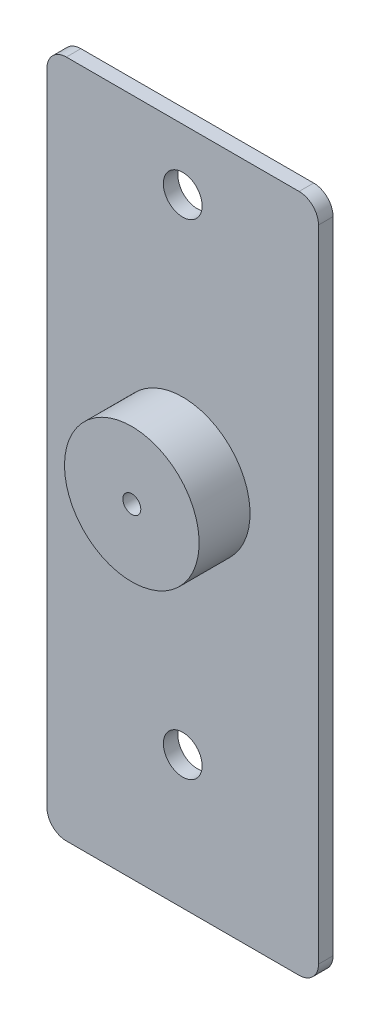
ISO-10303-21;
HEADER;
FILE_DESCRIPTION(('STEP AP214'),'2;1');
FILE_NAME('part.step','',(''),(''),'','','');
FILE_SCHEMA(('AUTOMOTIVE_DESIGN { 1 0 10303 214 1 1 1 1 }'));
ENDSEC;
DATA;
#1=APPLICATION_CONTEXT('core data for automotive mechanical design processes');
#2=APPLICATION_PROTOCOL_DEFINITION('international standard','automotive_design',2000,#1);
#3=PRODUCT_CONTEXT('',#1,'mechanical');
#4=PRODUCT('Part','Part','',(#3));
#5=PRODUCT_RELATED_PRODUCT_CATEGORY('part','',(#4));
#6=PRODUCT_DEFINITION_FORMATION('','',#4);
#7=PRODUCT_DEFINITION_CONTEXT('part definition',#1,'design');
#8=PRODUCT_DEFINITION('design','',#6,#7);
#9=PRODUCT_DEFINITION_SHAPE('','',#8);
#10=(LENGTH_UNIT() NAMED_UNIT(*) SI_UNIT(.MILLI.,.METRE.));
#11=(NAMED_UNIT(*) PLANE_ANGLE_UNIT() SI_UNIT($,.RADIAN.));
#12=(NAMED_UNIT(*) SI_UNIT($,.STERADIAN.) SOLID_ANGLE_UNIT());
#13=UNCERTAINTY_MEASURE_WITH_UNIT(LENGTH_MEASURE(1.E-05),#10,'distance_accuracy_value','');
#14=(GEOMETRIC_REPRESENTATION_CONTEXT(3) GLOBAL_UNCERTAINTY_ASSIGNED_CONTEXT((#13)) GLOBAL_UNIT_ASSIGNED_CONTEXT((#10,
#11,#12)) REPRESENTATION_CONTEXT('',''));
#15=CARTESIAN_POINT('',(0.,0.,0.));
#16=DIRECTION('',(0.,0.,1.));
#17=DIRECTION('',(1.,0.,0.));
#18=AXIS2_PLACEMENT_3D('',#15,#16,#17);
#19=CARTESIAN_POINT('',(0.,0.,0.));
#20=DIRECTION('',(0.,0.,-1.));
#21=DIRECTION('',(-1.,0.,0.));
#22=AXIS2_PLACEMENT_3D('',#19,#20,#21);
#23=PLANE('',#22);
#24=CARTESIAN_POINT('',(-0.000493654481067279,28.7050018310547,0.));
#25=DIRECTION('',(0.,0.,-1.));
#26=DIRECTION('',(-1.,0.,0.));
#27=AXIS2_PLACEMENT_3D('',#24,#25,#26);
#28=CIRCLE('',#27,2.);
#29=CARTESIAN_POINT('',(-2.00049365448107,28.7050018310547,0.));
#30=VERTEX_POINT('',#29);
#31=EDGE_CURVE('E186',#30,#30,#28,.T.);
#32=ORIENTED_EDGE('',*,*,#31,.T.);
#33=EDGE_LOOP('',(#32));
#34=FACE_BOUND('',#33,.T.);
#35=CARTESIAN_POINT('',(-0.000493892899487702,-21.2950005531311,0.));
#36=DIRECTION('',(0.,0.,-1.));
#37=DIRECTION('',(-1.,0.,0.));
#38=AXIS2_PLACEMENT_3D('',#35,#36,#37);
#39=CIRCLE('',#38,2.);
#40=CARTESIAN_POINT('',(-2.00049389289949,-21.2950005531311,0.));
#41=VERTEX_POINT('',#40);
#42=EDGE_CURVE('E180',#41,#41,#39,.T.);
#43=ORIENTED_EDGE('',*,*,#42,.T.);
#44=EDGE_LOOP('',(#43));
#45=FACE_BOUND('',#44,.T.);
#46=DIRECTION('',(-1.,0.,0.));
#47=VECTOR('',#46,1.);
#48=CARTESIAN_POINT('',(14.,-35.,0.));
#49=LINE('',#48,#47);
#50=CARTESIAN_POINT('',(12.,-35.,0.));
#51=VERTEX_POINT('',#50);
#52=CARTESIAN_POINT('',(-12.,-35.,0.));
#53=VERTEX_POINT('',#52);
#54=EDGE_CURVE('E115',#51,#53,#49,.T.);
#55=ORIENTED_EDGE('',*,*,#54,.F.);
#56=CARTESIAN_POINT('',(12.,-33.,0.));
#57=DIRECTION('',(0.,0.,-1.));
#58=DIRECTION('',(-1.,0.,0.));
#59=AXIS2_PLACEMENT_3D('',#56,#57,#58);
#60=CIRCLE('',#59,2.);
#61=CARTESIAN_POINT('',(14.,-33.,0.));
#62=VERTEX_POINT('',#61);
#63=EDGE_CURVE('E98',#51,#62,#60,.F.);
#64=ORIENTED_EDGE('',*,*,#63,.T.);
#65=DIRECTION('',(0.,-1.,0.));
#66=VECTOR('',#65,1.);
#67=CARTESIAN_POINT('',(14.,35.,0.));
#68=LINE('',#67,#66);
#69=CARTESIAN_POINT('',(14.,33.,0.));
#70=VERTEX_POINT('',#69);
#71=EDGE_CURVE('E125',#70,#62,#68,.T.);
#72=ORIENTED_EDGE('',*,*,#71,.F.);
#73=CARTESIAN_POINT('',(12.,33.,0.));
#74=DIRECTION('',(0.,0.,-1.));
#75=DIRECTION('',(-1.,0.,0.));
#76=AXIS2_PLACEMENT_3D('',#73,#74,#75);
#77=CIRCLE('',#76,2.);
#78=CARTESIAN_POINT('',(12.,35.,0.));
#79=VERTEX_POINT('',#78);
#80=EDGE_CURVE('E119',#70,#79,#77,.F.);
#81=ORIENTED_EDGE('',*,*,#80,.T.);
#82=DIRECTION('',(-1.,0.,0.));
#83=VECTOR('',#82,1.);
#84=CARTESIAN_POINT('',(14.,35.,0.));
#85=LINE('',#84,#83);
#86=CARTESIAN_POINT('',(-12.,35.,0.));
#87=VERTEX_POINT('',#86);
#88=EDGE_CURVE('E127',#79,#87,#85,.T.);
#89=ORIENTED_EDGE('',*,*,#88,.T.);
#90=CARTESIAN_POINT('',(-12.,33.,0.));
#91=DIRECTION('',(0.,0.,-1.));
#92=DIRECTION('',(-1.,0.,0.));
#93=AXIS2_PLACEMENT_3D('',#90,#91,#92);
#94=CIRCLE('',#93,2.);
#95=CARTESIAN_POINT('',(-14.,33.,0.));
#96=VERTEX_POINT('',#95);
#97=EDGE_CURVE('E142',#87,#96,#94,.F.);
#98=ORIENTED_EDGE('',*,*,#97,.T.);
#99=DIRECTION('',(0.,-1.,0.));
#100=VECTOR('',#99,1.);
#101=CARTESIAN_POINT('',(-14.,35.,0.));
#102=LINE('',#101,#100);
#103=CARTESIAN_POINT('',(-14.,-33.,0.));
#104=VERTEX_POINT('',#103);
#105=EDGE_CURVE('E124',#96,#104,#102,.T.);
#106=ORIENTED_EDGE('',*,*,#105,.T.);
#107=CARTESIAN_POINT('',(-12.,-33.,0.));
#108=DIRECTION('',(0.,0.,-1.));
#109=DIRECTION('',(-1.,0.,0.));
#110=AXIS2_PLACEMENT_3D('',#107,#108,#109);
#111=CIRCLE('',#110,2.);
#112=EDGE_CURVE('E109',#104,#53,#111,.F.);
#113=ORIENTED_EDGE('',*,*,#112,.T.);
#114=EDGE_LOOP('',(#55,#64,#72,#81,#89,#98,#106,#113));
#115=FACE_BOUND('',#114,.T.);
#116=CARTESIAN_POINT('',(0.,3.70356149548704,0.));
#117=DIRECTION('',(0.,0.,-1.));
#118=DIRECTION('',(-1.,0.,0.));
#119=AXIS2_PLACEMENT_3D('',#116,#117,#118);
#120=CIRCLE('',#119,6.94149340080354);
#121=CARTESIAN_POINT('',(-6.94149340080354,3.70356149548704,0.));
#122=VERTEX_POINT('',#121);
#123=EDGE_CURVE('E136',#122,#122,#120,.F.);
#124=ORIENTED_EDGE('',*,*,#123,.F.);
#125=EDGE_LOOP('',(#124));
#126=FACE_BOUND('',#125,.T.);
#127=ADVANCED_FACE('F32',(#34,#45,#115,#126),#23,.F.);
#128=CARTESIAN_POINT('',(14.,35.,-1.5));
#129=DIRECTION('',(-1.,0.,0.));
#130=DIRECTION('',(0.,-1.,0.));
#131=AXIS2_PLACEMENT_3D('',#128,#129,#130);
#132=PLANE('',#131);
#133=ORIENTED_EDGE('',*,*,#71,.T.);
#134=DIRECTION('',(0.,0.,1.));
#135=VECTOR('',#134,1.);
#136=CARTESIAN_POINT('',(14.,-33.,-1.5));
#137=LINE('',#136,#135);
#138=CARTESIAN_POINT('',(14.,-33.,-1.5));
#139=VERTEX_POINT('',#138);
#140=EDGE_CURVE('E103',#62,#139,#137,.F.);
#141=ORIENTED_EDGE('',*,*,#140,.T.);
#142=DIRECTION('',(0.,-1.,0.));
#143=VECTOR('',#142,1.);
#144=CARTESIAN_POINT('',(14.,35.,-1.5));
#145=LINE('',#144,#143);
#146=CARTESIAN_POINT('',(14.,33.,-1.5));
#147=VERTEX_POINT('',#146);
#148=EDGE_CURVE('E135',#147,#139,#145,.T.);
#149=ORIENTED_EDGE('',*,*,#148,.F.);
#150=DIRECTION('',(0.,0.,1.));
#151=VECTOR('',#150,1.);
#152=CARTESIAN_POINT('',(14.,33.,0.));
#153=LINE('',#152,#151);
#154=EDGE_CURVE('E108',#147,#70,#153,.T.);
#155=ORIENTED_EDGE('',*,*,#154,.T.);
#156=EDGE_LOOP('',(#133,#141,#149,#155));
#157=FACE_BOUND('',#156,.T.);
#158=ADVANCED_FACE('F220',(#157),#132,.F.);
#159=CARTESIAN_POINT('',(14.,-35.,-1.5));
#160=DIRECTION('',(0.,1.,0.));
#161=DIRECTION('',(0.,0.,1.));
#162=AXIS2_PLACEMENT_3D('',#159,#160,#161);
#163=PLANE('',#162);
#164=DIRECTION('',(-1.,0.,0.));
#165=VECTOR('',#164,1.);
#166=CARTESIAN_POINT('',(14.,-35.,-1.5));
#167=LINE('',#166,#165);
#168=CARTESIAN_POINT('',(12.,-35.,-1.5));
#169=VERTEX_POINT('',#168);
#170=CARTESIAN_POINT('',(-12.,-35.,-1.5));
#171=VERTEX_POINT('',#170);
#172=EDGE_CURVE('E118',#169,#171,#167,.T.);
#173=ORIENTED_EDGE('',*,*,#172,.F.);
#174=DIRECTION('',(0.,0.,1.));
#175=VECTOR('',#174,1.);
#176=CARTESIAN_POINT('',(12.,-35.,-1.5));
#177=LINE('',#176,#175);
#178=EDGE_CURVE('E102',#169,#51,#177,.T.);
#179=ORIENTED_EDGE('',*,*,#178,.T.);
#180=ORIENTED_EDGE('',*,*,#54,.T.);
#181=DIRECTION('',(0.,0.,1.));
#182=VECTOR('',#181,1.);
#183=CARTESIAN_POINT('',(-12.,-35.,-1.5));
#184=LINE('',#183,#182);
#185=EDGE_CURVE('E120',#53,#171,#184,.F.);
#186=ORIENTED_EDGE('',*,*,#185,.T.);
#187=EDGE_LOOP('',(#173,#179,#180,#186));
#188=FACE_BOUND('',#187,.T.);
#189=ADVANCED_FACE('F114',(#188),#163,.F.);
#190=CARTESIAN_POINT('',(-14.,35.,-1.5));
#191=DIRECTION('',(-1.,0.,0.));
#192=DIRECTION('',(0.,-1.,0.));
#193=AXIS2_PLACEMENT_3D('',#190,#191,#192);
#194=PLANE('',#193);
#195=DIRECTION('',(0.,-1.,0.));
#196=VECTOR('',#195,1.);
#197=CARTESIAN_POINT('',(-14.,35.,-1.5));
#198=LINE('',#197,#196);
#199=CARTESIAN_POINT('',(-14.,33.,-1.5));
#200=VERTEX_POINT('',#199);
#201=CARTESIAN_POINT('',(-14.,-33.,-1.5));
#202=VERTEX_POINT('',#201);
#203=EDGE_CURVE('E165',#200,#202,#198,.T.);
#204=ORIENTED_EDGE('',*,*,#203,.T.);
#205=DIRECTION('',(0.,0.,1.));
#206=VECTOR('',#205,1.);
#207=CARTESIAN_POINT('',(-14.,-33.,0.));
#208=LINE('',#207,#206);
#209=EDGE_CURVE('E157',#202,#104,#208,.T.);
#210=ORIENTED_EDGE('',*,*,#209,.T.);
#211=ORIENTED_EDGE('',*,*,#105,.F.);
#212=DIRECTION('',(0.,0.,1.));
#213=VECTOR('',#212,1.);
#214=CARTESIAN_POINT('',(-14.,33.,-1.5));
#215=LINE('',#214,#213);
#216=EDGE_CURVE('E155',#96,#200,#215,.F.);
#217=ORIENTED_EDGE('',*,*,#216,.T.);
#218=EDGE_LOOP('',(#204,#210,#211,#217));
#219=FACE_BOUND('',#218,.T.);
#220=ADVANCED_FACE('F163',(#219),#194,.T.);
#221=CARTESIAN_POINT('',(14.,35.,-1.5));
#222=DIRECTION('',(0.,1.,0.));
#223=DIRECTION('',(0.,0.,1.));
#224=AXIS2_PLACEMENT_3D('',#221,#222,#223);
#225=PLANE('',#224);
#226=DIRECTION('',(-1.,0.,0.));
#227=VECTOR('',#226,1.);
#228=CARTESIAN_POINT('',(14.,35.,-1.5));
#229=LINE('',#228,#227);
#230=CARTESIAN_POINT('',(12.,35.,-1.5));
#231=VERTEX_POINT('',#230);
#232=CARTESIAN_POINT('',(-12.,35.,-1.5));
#233=VERTEX_POINT('',#232);
#234=EDGE_CURVE('E139',#231,#233,#229,.T.);
#235=ORIENTED_EDGE('',*,*,#234,.T.);
#236=DIRECTION('',(0.,0.,1.));
#237=VECTOR('',#236,1.);
#238=CARTESIAN_POINT('',(-12.,35.,-1.5));
#239=LINE('',#238,#237);
#240=EDGE_CURVE('E11',#233,#87,#239,.T.);
#241=ORIENTED_EDGE('',*,*,#240,.T.);
#242=ORIENTED_EDGE('',*,*,#88,.F.);
#243=DIRECTION('',(0.,0.,1.));
#244=VECTOR('',#243,1.);
#245=CARTESIAN_POINT('',(12.,35.,-1.5));
#246=LINE('',#245,#244);
#247=EDGE_CURVE('E40',#79,#231,#246,.F.);
#248=ORIENTED_EDGE('',*,*,#247,.T.);
#249=EDGE_LOOP('',(#235,#241,#242,#248));
#250=FACE_BOUND('',#249,.T.);
#251=ADVANCED_FACE('F171',(#250),#225,.T.);
#252=CARTESIAN_POINT('',(0.,0.,-1.5));
#253=DIRECTION('',(0.,0.,-1.));
#254=DIRECTION('',(-1.,0.,0.));
#255=AXIS2_PLACEMENT_3D('',#252,#253,#254);
#256=PLANE('',#255);
#257=CARTESIAN_POINT('',(0.,3.70356149548704,-1.5));
#258=DIRECTION('',(0.,0.,-1.));
#259=DIRECTION('',(-1.,0.,0.));
#260=AXIS2_PLACEMENT_3D('',#257,#258,#259);
#261=CIRCLE('',#260,0.925);
#262=CARTESIAN_POINT('',(-0.925,3.70356149548704,-1.5));
#263=VERTEX_POINT('',#262);
#264=EDGE_CURVE('E193',#263,#263,#261,.T.);
#265=ORIENTED_EDGE('',*,*,#264,.F.);
#266=EDGE_LOOP('',(#265));
#267=FACE_BOUND('',#266,.T.);
#268=CARTESIAN_POINT('',(-0.000493654481067279,28.7050018310547,-1.5));
#269=DIRECTION('',(0.,0.,-1.));
#270=DIRECTION('',(-1.,0.,0.));
#271=AXIS2_PLACEMENT_3D('',#268,#269,#270);
#272=CIRCLE('',#271,2.);
#273=CARTESIAN_POINT('',(-2.00049365448107,28.7050018310547,-1.5));
#274=VERTEX_POINT('',#273);
#275=EDGE_CURVE('E189',#274,#274,#272,.T.);
#276=ORIENTED_EDGE('',*,*,#275,.F.);
#277=EDGE_LOOP('',(#276));
#278=FACE_BOUND('',#277,.T.);
#279=CARTESIAN_POINT('',(-0.000493892899487702,-21.2950005531311,-1.5));
#280=DIRECTION('',(0.,0.,-1.));
#281=DIRECTION('',(-1.,0.,0.));
#282=AXIS2_PLACEMENT_3D('',#279,#280,#281);
#283=CIRCLE('',#282,2.);
#284=CARTESIAN_POINT('',(-2.00049389289949,-21.2950005531311,-1.5));
#285=VERTEX_POINT('',#284);
#286=EDGE_CURVE('E183',#285,#285,#283,.T.);
#287=ORIENTED_EDGE('',*,*,#286,.F.);
#288=EDGE_LOOP('',(#287));
#289=FACE_BOUND('',#288,.T.);
#290=ORIENTED_EDGE('',*,*,#148,.T.);
#291=CARTESIAN_POINT('',(12.,-33.,-1.5));
#292=DIRECTION('',(0.,0.,-1.));
#293=DIRECTION('',(-1.,0.,0.));
#294=AXIS2_PLACEMENT_3D('',#291,#292,#293);
#295=CIRCLE('',#294,2.);
#296=EDGE_CURVE('E153',#139,#169,#295,.T.);
#297=ORIENTED_EDGE('',*,*,#296,.T.);
#298=ORIENTED_EDGE('',*,*,#172,.T.);
#299=CARTESIAN_POINT('',(-12.,-33.,-1.5));
#300=DIRECTION('',(0.,0.,-1.));
#301=DIRECTION('',(-1.,0.,0.));
#302=AXIS2_PLACEMENT_3D('',#299,#300,#301);
#303=CIRCLE('',#302,2.);
#304=EDGE_CURVE('E151',#171,#202,#303,.T.);
#305=ORIENTED_EDGE('',*,*,#304,.T.);
#306=ORIENTED_EDGE('',*,*,#203,.F.);
#307=CARTESIAN_POINT('',(-12.,33.,-1.5));
#308=DIRECTION('',(0.,0.,-1.));
#309=DIRECTION('',(-1.,0.,0.));
#310=AXIS2_PLACEMENT_3D('',#307,#308,#309);
#311=CIRCLE('',#310,2.);
#312=EDGE_CURVE('E47',#200,#233,#311,.T.);
#313=ORIENTED_EDGE('',*,*,#312,.T.);
#314=ORIENTED_EDGE('',*,*,#234,.F.);
#315=CARTESIAN_POINT('',(12.,33.,-1.5));
#316=DIRECTION('',(0.,0.,-1.));
#317=DIRECTION('',(-1.,0.,0.));
#318=AXIS2_PLACEMENT_3D('',#315,#316,#317);
#319=CIRCLE('',#318,2.);
#320=EDGE_CURVE('E148',#231,#147,#319,.T.);
#321=ORIENTED_EDGE('',*,*,#320,.T.);
#322=EDGE_LOOP('',(#290,#297,#298,#305,#306,#313,#314,#321));
#323=FACE_BOUND('',#322,.T.);
#324=ADVANCED_FACE('F209',(#267,#278,#289,#323),#256,.T.);
#325=CARTESIAN_POINT('',(0.,3.70356149548704,5.25));
#326=DIRECTION('',(0.,0.,-1.));
#327=DIRECTION('',(-1.,0.,0.));
#328=AXIS2_PLACEMENT_3D('',#325,#326,#327);
#329=CYLINDRICAL_SURFACE('',#328,6.94149340080354);
#330=CARTESIAN_POINT('',(0.,3.70356149548704,5.25));
#331=DIRECTION('',(0.,0.,1.));
#332=DIRECTION('',(1.,0.,0.));
#333=AXIS2_PLACEMENT_3D('',#330,#331,#332);
#334=CIRCLE('',#333,6.94149340080354);
#335=CARTESIAN_POINT('',(-6.94149340080354,3.70356149548704,5.25));
#336=VERTEX_POINT('',#335);
#337=EDGE_CURVE('E129',#336,#336,#334,.T.);
#338=CARTESIAN_POINT('',(-6.94149340080354,3.70356149548704,5.25));
#339=CARTESIAN_POINT('',(-6.94149340080354,3.70356149548704,5.1953125));
#340=CARTESIAN_POINT('',(-6.94149340080354,3.70356149548704,5.140625));
#341=CARTESIAN_POINT('',(-6.94149340080354,3.70356149548704,5.03125));
#342=CARTESIAN_POINT('',(-6.94149340080354,3.70356149548704,4.9765625));
#343=CARTESIAN_POINT('',(-6.94149340080354,3.70356149548704,4.8671875));
#344=CARTESIAN_POINT('',(-6.94149340080354,3.70356149548704,4.8125));
#345=CARTESIAN_POINT('',(-6.94149340080354,3.70356149548704,4.703125));
#346=CARTESIAN_POINT('',(-6.94149340080354,3.70356149548704,4.6484375));
#347=CARTESIAN_POINT('',(-6.94149340080354,3.70356149548704,4.5390625));
#348=CARTESIAN_POINT('',(-6.94149340080354,3.70356149548704,4.484375));
#349=CARTESIAN_POINT('',(-6.94149340080354,3.70356149548704,4.375));
#350=CARTESIAN_POINT('',(-6.94149340080354,3.70356149548704,4.3203125));
#351=CARTESIAN_POINT('',(-6.94149340080354,3.70356149548704,4.2109375));
#352=CARTESIAN_POINT('',(-6.94149340080354,3.70356149548704,4.15625));
#353=CARTESIAN_POINT('',(-6.94149340080354,3.70356149548704,4.046875));
#354=CARTESIAN_POINT('',(-6.94149340080354,3.70356149548704,3.9921875));
#355=CARTESIAN_POINT('',(-6.94149340080354,3.70356149548704,3.8828125));
#356=CARTESIAN_POINT('',(-6.94149340080354,3.70356149548704,3.828125));
#357=CARTESIAN_POINT('',(-6.94149340080354,3.70356149548704,3.71875));
#358=CARTESIAN_POINT('',(-6.94149340080354,3.70356149548704,3.6640625));
#359=CARTESIAN_POINT('',(-6.94149340080354,3.70356149548704,3.5546875));
#360=CARTESIAN_POINT('',(-6.94149340080354,3.70356149548704,3.5));
#361=CARTESIAN_POINT('',(-6.94149340080354,3.70356149548704,3.390625));
#362=CARTESIAN_POINT('',(-6.94149340080354,3.70356149548704,3.3359375));
#363=CARTESIAN_POINT('',(-6.94149340080354,3.70356149548704,3.2265625));
#364=CARTESIAN_POINT('',(-6.94149340080354,3.70356149548704,3.171875));
#365=CARTESIAN_POINT('',(-6.94149340080354,3.70356149548704,3.0625));
#366=CARTESIAN_POINT('',(-6.94149340080354,3.70356149548704,3.0078125));
#367=CARTESIAN_POINT('',(-6.94149340080354,3.70356149548704,2.8984375));
#368=CARTESIAN_POINT('',(-6.94149340080354,3.70356149548704,2.84375));
#369=CARTESIAN_POINT('',(-6.94149340080354,3.70356149548704,2.734375));
#370=CARTESIAN_POINT('',(-6.94149340080354,3.70356149548704,2.6796875));
#371=CARTESIAN_POINT('',(-6.94149340080354,3.70356149548704,2.5703125));
#372=CARTESIAN_POINT('',(-6.94149340080354,3.70356149548704,2.515625));
#373=CARTESIAN_POINT('',(-6.94149340080354,3.70356149548704,2.40625));
#374=CARTESIAN_POINT('',(-6.94149340080354,3.70356149548704,2.3515625));
#375=CARTESIAN_POINT('',(-6.94149340080354,3.70356149548704,2.2421875));
#376=CARTESIAN_POINT('',(-6.94149340080354,3.70356149548704,2.1875));
#377=CARTESIAN_POINT('',(-6.94149340080354,3.70356149548704,2.078125));
#378=CARTESIAN_POINT('',(-6.94149340080354,3.70356149548704,2.0234375));
#379=CARTESIAN_POINT('',(-6.94149340080354,3.70356149548704,1.9140625));
#380=CARTESIAN_POINT('',(-6.94149340080354,3.70356149548704,1.859375));
#381=CARTESIAN_POINT('',(-6.94149340080354,3.70356149548704,1.75));
#382=CARTESIAN_POINT('',(-6.94149340080354,3.70356149548704,1.6953125));
#383=CARTESIAN_POINT('',(-6.94149340080354,3.70356149548704,1.5859375));
#384=CARTESIAN_POINT('',(-6.94149340080354,3.70356149548704,1.53125));
#385=CARTESIAN_POINT('',(-6.94149340080354,3.70356149548704,1.421875));
#386=CARTESIAN_POINT('',(-6.94149340080354,3.70356149548704,1.3671875));
#387=CARTESIAN_POINT('',(-6.94149340080354,3.70356149548704,1.2578125));
#388=CARTESIAN_POINT('',(-6.94149340080354,3.70356149548704,1.203125));
#389=CARTESIAN_POINT('',(-6.94149340080354,3.70356149548704,1.09375));
#390=CARTESIAN_POINT('',(-6.94149340080354,3.70356149548704,1.0390625));
#391=CARTESIAN_POINT('',(-6.94149340080354,3.70356149548704,0.9296875));
#392=CARTESIAN_POINT('',(-6.94149340080354,3.70356149548704,0.875));
#393=CARTESIAN_POINT('',(-6.94149340080354,3.70356149548704,0.765625));
#394=CARTESIAN_POINT('',(-6.94149340080354,3.70356149548704,0.7109375));
#395=CARTESIAN_POINT('',(-6.94149340080354,3.70356149548704,0.601562500000001));
#396=CARTESIAN_POINT('',(-6.94149340080354,3.70356149548704,0.546875));
#397=CARTESIAN_POINT('',(-6.94149340080354,3.70356149548704,0.4375));
#398=CARTESIAN_POINT('',(-6.94149340080354,3.70356149548704,0.3828125));
#399=CARTESIAN_POINT('',(-6.94149340080354,3.70356149548704,0.2734375));
#400=CARTESIAN_POINT('',(-6.94149340080354,3.70356149548704,0.21875));
#401=CARTESIAN_POINT('',(-6.94149340080354,3.70356149548704,0.109375));
#402=CARTESIAN_POINT('',(-6.94149340080354,3.70356149548704,0.0546875));
#403=CARTESIAN_POINT('',(-6.94149340080354,3.70356149548704,0.));
#404=B_SPLINE_CURVE_WITH_KNOTS('',3,(#338,#339,#340,#341,#342,#343,#344,#345,#346,#347,#348,
#349,#350,#351,#352,#353,#354,#355,#356,#357,#358,#359,#360,#361,#362,#363,#364,#365,#366,#367,
#368,#369,#370,#371,#372,#373,#374,#375,#376,#377,#378,#379,#380,#381,#382,#383,#384,#385,#386,
#387,#388,#389,#390,#391,#392,#393,#394,#395,#396,#397,#398,#399,#400,#401,#402,#403),
.UNSPECIFIED.,.F.,.F.,(4,2,2,2,2,2,2,2,2,2,2,2,2,2,2,2,2,2,2,2,2,2,2,2,2,2,2,2,2,2,2,2,4),(0.,
0.1640625,0.328125,0.4921875,0.656250000000001,0.820312500000001,0.984375,1.1484375,1.3125,
1.4765625,1.640625,1.8046875,1.96875,2.1328125,2.296875,2.4609375,2.625,2.7890625,2.953125,
3.1171875,3.28125,3.4453125,3.609375,3.7734375,3.9375,4.1015625,4.265625,4.4296875,4.59375,
4.7578125,4.921875,5.0859375,5.25),.UNSPECIFIED.);
#405=EDGE_CURVE('BSEAM212',#336,#122,#404,.T.);
#406=ORIENTED_EDGE('',*,*,#337,.F.);
#407=ORIENTED_EDGE('',*,*,#123,.T.);
#408=ORIENTED_EDGE('',*,*,#405,.T.);
#409=ORIENTED_EDGE('',*,*,#405,.F.);
#410=EDGE_LOOP('',(#406,#408,#407,#409));
#411=FACE_BOUND('',#410,.T.);
#412=ADVANCED_FACE('F212',(#411),#329,.T.);
#413=CARTESIAN_POINT('',(0.,3.70356149548704,5.25));
#414=DIRECTION('',(0.,0.,1.));
#415=DIRECTION('',(1.,0.,0.));
#416=AXIS2_PLACEMENT_3D('',#413,#414,#415);
#417=PLANE('',#416);
#418=CARTESIAN_POINT('',(0.,3.70356149548704,5.25));
#419=DIRECTION('',(0.,0.,-1.));
#420=DIRECTION('',(-1.,0.,0.));
#421=AXIS2_PLACEMENT_3D('',#418,#419,#420);
#422=CIRCLE('',#421,0.925);
#423=CARTESIAN_POINT('',(-0.925,3.70356149548704,5.25));
#424=VERTEX_POINT('',#423);
#425=EDGE_CURVE('E192',#424,#424,#422,.T.);
#426=ORIENTED_EDGE('',*,*,#425,.T.);
#427=EDGE_LOOP('',(#426));
#428=FACE_BOUND('',#427,.T.);
#429=ORIENTED_EDGE('',*,*,#337,.T.);
#430=EDGE_LOOP('',(#429));
#431=FACE_BOUND('',#430,.T.);
#432=ADVANCED_FACE('F199',(#428,#431),#417,.T.);
#433=CARTESIAN_POINT('',(-0.000493892899487702,-21.2950005531311,5.25));
#434=DIRECTION('',(0.,0.,-1.));
#435=DIRECTION('',(-1.,0.,0.));
#436=AXIS2_PLACEMENT_3D('',#433,#434,#435);
#437=CYLINDRICAL_SURFACE('',#436,2.);
#438=ORIENTED_EDGE('',*,*,#286,.T.);
#439=EDGE_LOOP('',(#438));
#440=FACE_BOUND('',#439,.T.);
#441=ORIENTED_EDGE('',*,*,#42,.F.);
#442=EDGE_LOOP('',(#441));
#443=FACE_BOUND('',#442,.T.);
#444=ADVANCED_FACE('F280',(#440,#443),#437,.F.);
#445=CARTESIAN_POINT('',(-0.000493654481067279,28.7050018310547,5.25));
#446=DIRECTION('',(0.,0.,-1.));
#447=DIRECTION('',(-1.,0.,0.));
#448=AXIS2_PLACEMENT_3D('',#445,#446,#447);
#449=CYLINDRICAL_SURFACE('',#448,2.);
#450=ORIENTED_EDGE('',*,*,#275,.T.);
#451=EDGE_LOOP('',(#450));
#452=FACE_BOUND('',#451,.T.);
#453=ORIENTED_EDGE('',*,*,#31,.F.);
#454=EDGE_LOOP('',(#453));
#455=FACE_BOUND('',#454,.T.);
#456=ADVANCED_FACE('F205',(#452,#455),#449,.F.);
#457=CARTESIAN_POINT('',(0.,3.70356149548704,5.25));
#458=DIRECTION('',(0.,0.,-1.));
#459=DIRECTION('',(-1.,0.,0.));
#460=AXIS2_PLACEMENT_3D('',#457,#458,#459);
#461=CYLINDRICAL_SURFACE('',#460,0.925);
#462=ORIENTED_EDGE('',*,*,#425,.F.);
#463=EDGE_LOOP('',(#462));
#464=FACE_BOUND('',#463,.T.);
#465=ORIENTED_EDGE('',*,*,#264,.T.);
#466=EDGE_LOOP('',(#465));
#467=FACE_BOUND('',#466,.T.);
#468=ADVANCED_FACE('F202',(#464,#467),#461,.F.);
#469=CARTESIAN_POINT('',(12.,-33.,-1.5));
#470=DIRECTION('',(0.,0.,1.));
#471=DIRECTION('',(1.,0.,0.));
#472=AXIS2_PLACEMENT_3D('',#469,#470,#471);
#473=CYLINDRICAL_SURFACE('',#472,2.);
#474=ORIENTED_EDGE('',*,*,#296,.F.);
#475=ORIENTED_EDGE('',*,*,#140,.F.);
#476=ORIENTED_EDGE('',*,*,#63,.F.);
#477=ORIENTED_EDGE('',*,*,#178,.F.);
#478=EDGE_LOOP('',(#474,#475,#476,#477));
#479=FACE_BOUND('',#478,.T.);
#480=ADVANCED_FACE('F101',(#479),#473,.T.);
#481=CARTESIAN_POINT('',(-12.,-33.,-1.5));
#482=DIRECTION('',(0.,0.,-1.));
#483=DIRECTION('',(-1.,0.,0.));
#484=AXIS2_PLACEMENT_3D('',#481,#482,#483);
#485=CYLINDRICAL_SURFACE('',#484,2.);
#486=ORIENTED_EDGE('',*,*,#304,.F.);
#487=ORIENTED_EDGE('',*,*,#185,.F.);
#488=ORIENTED_EDGE('',*,*,#112,.F.);
#489=ORIENTED_EDGE('',*,*,#209,.F.);
#490=EDGE_LOOP('',(#486,#487,#488,#489));
#491=FACE_BOUND('',#490,.T.);
#492=ADVANCED_FACE('F226',(#491),#485,.T.);
#493=CARTESIAN_POINT('',(-12.,33.,-1.5));
#494=DIRECTION('',(0.,0.,1.));
#495=DIRECTION('',(1.,0.,0.));
#496=AXIS2_PLACEMENT_3D('',#493,#494,#495);
#497=CYLINDRICAL_SURFACE('',#496,2.);
#498=ORIENTED_EDGE('',*,*,#312,.F.);
#499=ORIENTED_EDGE('',*,*,#216,.F.);
#500=ORIENTED_EDGE('',*,*,#97,.F.);
#501=ORIENTED_EDGE('',*,*,#240,.F.);
#502=EDGE_LOOP('',(#498,#499,#500,#501));
#503=FACE_BOUND('',#502,.T.);
#504=ADVANCED_FACE('F170',(#503),#497,.T.);
#505=CARTESIAN_POINT('',(12.,33.,-1.5));
#506=DIRECTION('',(0.,0.,-1.));
#507=DIRECTION('',(-1.,0.,0.));
#508=AXIS2_PLACEMENT_3D('',#505,#506,#507);
#509=CYLINDRICAL_SURFACE('',#508,2.);
#510=ORIENTED_EDGE('',*,*,#320,.F.);
#511=ORIENTED_EDGE('',*,*,#247,.F.);
#512=ORIENTED_EDGE('',*,*,#80,.F.);
#513=ORIENTED_EDGE('',*,*,#154,.F.);
#514=EDGE_LOOP('',(#510,#511,#512,#513));
#515=FACE_BOUND('',#514,.T.);
#516=ADVANCED_FACE('F34',(#515),#509,.T.);
#517=CLOSED_SHELL('',(#127,#158,#189,#220,#251,#324,#412,#432,#444,#456,#468,#480,#492,#504,#516));
#518=MANIFOLD_SOLID_BREP('B2',#517);
#519=ADVANCED_BREP_SHAPE_REPRESENTATION('',(#18,#518),#14);
#520=SHAPE_DEFINITION_REPRESENTATION(#9,#519);
ENDSEC;
END-ISO-10303-21;
